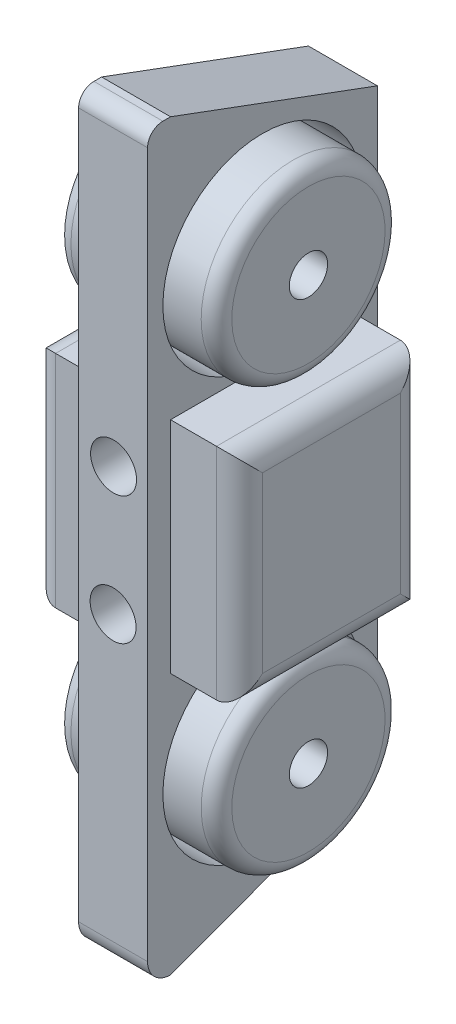
ISO-10303-21;
HEADER;
FILE_DESCRIPTION(('STEP AP214'),'2;1');
FILE_NAME('part.step','',(''),(''),'','','');
FILE_SCHEMA(('AUTOMOTIVE_DESIGN { 1 0 10303 214 1 1 1 1 }'));
ENDSEC;
DATA;
#1=APPLICATION_CONTEXT('core data for automotive mechanical design processes');
#2=APPLICATION_PROTOCOL_DEFINITION('international standard','automotive_design',2000,#1);
#3=PRODUCT_CONTEXT('',#1,'mechanical');
#4=PRODUCT('Part','Part','',(#3));
#5=PRODUCT_RELATED_PRODUCT_CATEGORY('part','',(#4));
#6=PRODUCT_DEFINITION_FORMATION('','',#4);
#7=PRODUCT_DEFINITION_CONTEXT('part definition',#1,'design');
#8=PRODUCT_DEFINITION('design','',#6,#7);
#9=PRODUCT_DEFINITION_SHAPE('','',#8);
#10=(LENGTH_UNIT() NAMED_UNIT(*) SI_UNIT(.MILLI.,.METRE.));
#11=(NAMED_UNIT(*) PLANE_ANGLE_UNIT() SI_UNIT($,.RADIAN.));
#12=(NAMED_UNIT(*) SI_UNIT($,.STERADIAN.) SOLID_ANGLE_UNIT());
#13=UNCERTAINTY_MEASURE_WITH_UNIT(LENGTH_MEASURE(1.E-05),#10,'distance_accuracy_value','');
#14=(GEOMETRIC_REPRESENTATION_CONTEXT(3) GLOBAL_UNCERTAINTY_ASSIGNED_CONTEXT((#13)) GLOBAL_UNIT_ASSIGNED_CONTEXT((#10,
#11,#12)) REPRESENTATION_CONTEXT('',''));
#15=CARTESIAN_POINT('',(0.,0.,0.));
#16=DIRECTION('',(0.,0.,1.));
#17=DIRECTION('',(1.,0.,0.));
#18=AXIS2_PLACEMENT_3D('',#15,#16,#17);
#19=CARTESIAN_POINT('',(15.,76.1111111111111,-12.));
#20=DIRECTION('',(-1.,0.,0.));
#21=DIRECTION('',(0.,-1.,0.));
#22=AXIS2_PLACEMENT_3D('',#19,#20,#21);
#23=CYLINDRICAL_SURFACE('',#22,12.);
#24=CARTESIAN_POINT('',(-4.,76.1111111111111,-12.));
#25=DIRECTION('',(-1.,0.,0.));
#26=DIRECTION('',(0.,0.,1.));
#27=AXIS2_PLACEMENT_3D('',#24,#25,#26);
#28=CIRCLE('',#27,12.);
#29=CARTESIAN_POINT('',(-4.,76.1111111111111,0.));
#30=VERTEX_POINT('',#29);
#31=EDGE_CURVE('E62',#30,#30,#28,.F.);
#32=ORIENTED_EDGE('',*,*,#31,.T.);
#33=EDGE_LOOP('',(#32));
#34=FACE_BOUND('',#33,.T.);
#35=CARTESIAN_POINT('',(13.,76.1111111111111,-12.));
#36=DIRECTION('',(1.,0.,0.));
#37=DIRECTION('',(0.,1.,0.));
#38=AXIS2_PLACEMENT_3D('',#35,#36,#37);
#39=CIRCLE('',#38,12.);
#40=CARTESIAN_POINT('',(13.,88.1111111111111,-12.));
#41=VERTEX_POINT('',#40);
#42=EDGE_CURVE('E66',#41,#41,#39,.F.);
#43=ORIENTED_EDGE('',*,*,#42,.T.);
#44=EDGE_LOOP('',(#43));
#45=FACE_BOUND('',#44,.T.);
#46=ADVANCED_FACE('F55',(#34,#45),#23,.T.);
#47=CARTESIAN_POINT('',(15.,0.,0.));
#48=DIRECTION('',(1.,0.,0.));
#49=DIRECTION('',(0.,1.,0.));
#50=AXIS2_PLACEMENT_3D('',#47,#48,#49);
#51=PLANE('',#50);
#52=CARTESIAN_POINT('',(15.,76.1111111111111,-12.));
#53=DIRECTION('',(1.,0.,0.));
#54=DIRECTION('',(0.,1.,0.));
#55=AXIS2_PLACEMENT_3D('',#52,#53,#54);
#56=CIRCLE('',#55,9.99999999999999);
#57=CARTESIAN_POINT('',(15.,86.1111111111111,-12.));
#58=VERTEX_POINT('',#57);
#59=EDGE_CURVE('E12',#58,#58,#56,.T.);
#60=ORIENTED_EDGE('',*,*,#59,.T.);
#61=EDGE_LOOP('',(#60));
#62=FACE_BOUND('',#61,.T.);
#63=CARTESIAN_POINT('',(15.,76.1111111111111,-12.));
#64=DIRECTION('',(1.,0.,0.));
#65=DIRECTION('',(0.,1.,0.));
#66=AXIS2_PLACEMENT_3D('',#63,#64,#65);
#67=CIRCLE('',#66,2.5);
#68=CARTESIAN_POINT('',(15.,78.6111111111111,-12.));
#69=VERTEX_POINT('',#68);
#70=EDGE_CURVE('E78',#69,#69,#67,.T.);
#71=ORIENTED_EDGE('',*,*,#70,.F.);
#72=EDGE_LOOP('',(#71));
#73=FACE_BOUND('',#72,.T.);
#74=ADVANCED_FACE('F85',(#62,#73),#51,.T.);
#75=CARTESIAN_POINT('',(-6.,0.,0.));
#76=DIRECTION('',(-1.,0.,0.));
#77=DIRECTION('',(0.,0.,1.));
#78=AXIS2_PLACEMENT_3D('',#75,#76,#77);
#79=PLANE('',#78);
#80=CARTESIAN_POINT('',(-6.,76.1111111111111,-12.));
#81=DIRECTION('',(-1.,0.,0.));
#82=DIRECTION('',(0.,0.,1.));
#83=AXIS2_PLACEMENT_3D('',#80,#81,#82);
#84=CIRCLE('',#83,9.99999999999999);
#85=CARTESIAN_POINT('',(-6.,76.1111111111111,-2.00000000000001));
#86=VERTEX_POINT('',#85);
#87=EDGE_CURVE('E70',#86,#86,#84,.T.);
#88=ORIENTED_EDGE('',*,*,#87,.T.);
#89=EDGE_LOOP('',(#88));
#90=FACE_BOUND('',#89,.T.);
#91=CARTESIAN_POINT('',(-6.,76.1111111111111,-12.));
#92=DIRECTION('',(-1.,0.,0.));
#93=DIRECTION('',(0.,0.,1.));
#94=AXIS2_PLACEMENT_3D('',#91,#92,#93);
#95=CIRCLE('',#94,2.5);
#96=CARTESIAN_POINT('',(-6.,76.1111111111111,-9.5));
#97=VERTEX_POINT('',#96);
#98=EDGE_CURVE('E75',#97,#97,#95,.T.);
#99=ORIENTED_EDGE('',*,*,#98,.F.);
#100=EDGE_LOOP('',(#99));
#101=FACE_BOUND('',#100,.T.);
#102=ADVANCED_FACE('F87',(#90,#101),#79,.T.);
#103=CARTESIAN_POINT('',(40.,76.1111111111111,-12.));
#104=DIRECTION('',(-1.,0.,0.));
#105=DIRECTION('',(0.,0.,1.));
#106=AXIS2_PLACEMENT_3D('',#103,#104,#105);
#107=CYLINDRICAL_SURFACE('',#106,2.5);
#108=ORIENTED_EDGE('',*,*,#70,.T.);
#109=EDGE_LOOP('',(#108));
#110=FACE_BOUND('',#109,.T.);
#111=ORIENTED_EDGE('',*,*,#98,.T.);
#112=EDGE_LOOP('',(#111));
#113=FACE_BOUND('',#112,.T.);
#114=ADVANCED_FACE('F82',(#110,#113),#107,.F.);
#115=CARTESIAN_POINT('',(-4.,76.1111111111111,-12.));
#116=DIRECTION('',(-1.,0.,0.));
#117=DIRECTION('',(0.,0.,1.));
#118=AXIS2_PLACEMENT_3D('',#115,#116,#117);
#119=TOROIDAL_SURFACE('',#118,9.99999999999999,2.);
#120=ORIENTED_EDGE('',*,*,#31,.F.);
#121=EDGE_LOOP('',(#120));
#122=FACE_BOUND('',#121,.T.);
#123=ORIENTED_EDGE('',*,*,#87,.F.);
#124=EDGE_LOOP('',(#123));
#125=FACE_BOUND('',#124,.T.);
#126=ADVANCED_FACE('F98',(#122,#125),#119,.T.);
#127=CARTESIAN_POINT('',(13.,76.1111111111111,-12.));
#128=DIRECTION('',(1.,0.,0.));
#129=DIRECTION('',(0.,1.,0.));
#130=AXIS2_PLACEMENT_3D('',#127,#128,#129);
#131=TOROIDAL_SURFACE('',#130,9.99999999999999,2.);
#132=ORIENTED_EDGE('',*,*,#42,.F.);
#133=EDGE_LOOP('',(#132));
#134=FACE_BOUND('',#133,.T.);
#135=ORIENTED_EDGE('',*,*,#59,.F.);
#136=EDGE_LOOP('',(#135));
#137=FACE_BOUND('',#136,.T.);
#138=ADVANCED_FACE('F57',(#134,#137),#131,.T.);
#139=CLOSED_SHELL('',(#46,#74,#102,#114,#126,#138));
#140=MANIFOLD_SOLID_BREP('B2',#139);
#141=CARTESIAN_POINT('',(-6.,0.,0.));
#142=DIRECTION('',(-1.,0.,0.));
#143=DIRECTION('',(0.,0.,1.));
#144=AXIS2_PLACEMENT_3D('',#141,#142,#143);
#145=PLANE('',#144);
#146=CARTESIAN_POINT('',(-6.,20.8888888888889,-12.));
#147=DIRECTION('',(-1.,0.,0.));
#148=DIRECTION('',(0.,0.,1.));
#149=AXIS2_PLACEMENT_3D('',#146,#147,#148);
#150=CIRCLE('',#149,10.);
#151=CARTESIAN_POINT('',(-6.,20.8888888888889,-1.99999999999999));
#152=VERTEX_POINT('',#151);
#153=EDGE_CURVE('E182',#152,#152,#150,.T.);
#154=ORIENTED_EDGE('',*,*,#153,.T.);
#155=EDGE_LOOP('',(#154));
#156=FACE_BOUND('',#155,.T.);
#157=CARTESIAN_POINT('',(-6.,20.8888888888889,-12.));
#158=DIRECTION('',(-1.,0.,0.));
#159=DIRECTION('',(0.,0.,1.));
#160=AXIS2_PLACEMENT_3D('',#157,#158,#159);
#161=CIRCLE('',#160,2.5);
#162=CARTESIAN_POINT('',(-6.,20.8888888888889,-9.49999999999999));
#163=VERTEX_POINT('',#162);
#164=EDGE_CURVE('E187',#163,#163,#161,.T.);
#165=ORIENTED_EDGE('',*,*,#164,.F.);
#166=EDGE_LOOP('',(#165));
#167=FACE_BOUND('',#166,.T.);
#168=ADVANCED_FACE('F167',(#156,#167),#145,.T.);
#169=CARTESIAN_POINT('',(-6.,20.8888888888889,-12.));
#170=DIRECTION('',(1.,0.,0.));
#171=DIRECTION('',(0.,0.,-1.));
#172=AXIS2_PLACEMENT_3D('',#169,#170,#171);
#173=CYLINDRICAL_SURFACE('',#172,12.);
#174=CARTESIAN_POINT('',(-4.,20.8888888888889,-12.));
#175=DIRECTION('',(-1.,0.,0.));
#176=DIRECTION('',(0.,0.,1.));
#177=AXIS2_PLACEMENT_3D('',#174,#175,#176);
#178=CIRCLE('',#177,12.);
#179=CARTESIAN_POINT('',(-4.,20.8888888888889,0.));
#180=VERTEX_POINT('',#179);
#181=EDGE_CURVE('E174',#180,#180,#178,.F.);
#182=ORIENTED_EDGE('',*,*,#181,.T.);
#183=EDGE_LOOP('',(#182));
#184=FACE_BOUND('',#183,.T.);
#185=CARTESIAN_POINT('',(13.,20.8888888888889,-12.));
#186=DIRECTION('',(1.,0.,0.));
#187=DIRECTION('',(0.,1.,0.));
#188=AXIS2_PLACEMENT_3D('',#185,#186,#187);
#189=CIRCLE('',#188,12.);
#190=CARTESIAN_POINT('',(13.,32.8888888888889,-12.));
#191=VERTEX_POINT('',#190);
#192=EDGE_CURVE('E178',#191,#191,#189,.F.);
#193=ORIENTED_EDGE('',*,*,#192,.T.);
#194=EDGE_LOOP('',(#193));
#195=FACE_BOUND('',#194,.T.);
#196=ADVANCED_FACE('F206',(#184,#195),#173,.T.);
#197=CARTESIAN_POINT('',(40.,20.8888888888889,-12.));
#198=DIRECTION('',(-1.,0.,0.));
#199=DIRECTION('',(0.,0.,1.));
#200=AXIS2_PLACEMENT_3D('',#197,#198,#199);
#201=CYLINDRICAL_SURFACE('',#200,2.5);
#202=CARTESIAN_POINT('',(15.,20.8888888888889,-12.));
#203=DIRECTION('',(1.,0.,0.));
#204=DIRECTION('',(0.,1.,0.));
#205=AXIS2_PLACEMENT_3D('',#202,#203,#204);
#206=CIRCLE('',#205,2.5);
#207=CARTESIAN_POINT('',(15.,23.3888888888889,-12.));
#208=VERTEX_POINT('',#207);
#209=EDGE_CURVE('E190',#208,#208,#206,.T.);
#210=ORIENTED_EDGE('',*,*,#209,.T.);
#211=EDGE_LOOP('',(#210));
#212=FACE_BOUND('',#211,.T.);
#213=ORIENTED_EDGE('',*,*,#164,.T.);
#214=EDGE_LOOP('',(#213));
#215=FACE_BOUND('',#214,.T.);
#216=ADVANCED_FACE('F194',(#212,#215),#201,.F.);
#217=CARTESIAN_POINT('',(15.,0.,0.));
#218=DIRECTION('',(1.,0.,0.));
#219=DIRECTION('',(0.,1.,0.));
#220=AXIS2_PLACEMENT_3D('',#217,#218,#219);
#221=PLANE('',#220);
#222=CARTESIAN_POINT('',(15.,20.8888888888889,-12.));
#223=DIRECTION('',(1.,0.,0.));
#224=DIRECTION('',(0.,1.,0.));
#225=AXIS2_PLACEMENT_3D('',#222,#223,#224);
#226=CIRCLE('',#225,10.);
#227=CARTESIAN_POINT('',(15.,30.8888888888889,-12.));
#228=VERTEX_POINT('',#227);
#229=EDGE_CURVE('E54',#228,#228,#226,.T.);
#230=ORIENTED_EDGE('',*,*,#229,.T.);
#231=EDGE_LOOP('',(#230));
#232=FACE_BOUND('',#231,.T.);
#233=ORIENTED_EDGE('',*,*,#209,.F.);
#234=EDGE_LOOP('',(#233));
#235=FACE_BOUND('',#234,.T.);
#236=ADVANCED_FACE('F197',(#232,#235),#221,.T.);
#237=CARTESIAN_POINT('',(-4.,20.8888888888889,-12.));
#238=DIRECTION('',(-1.,0.,0.));
#239=DIRECTION('',(0.,0.,1.));
#240=AXIS2_PLACEMENT_3D('',#237,#238,#239);
#241=TOROIDAL_SURFACE('',#240,10.,2.);
#242=ORIENTED_EDGE('',*,*,#181,.F.);
#243=EDGE_LOOP('',(#242));
#244=FACE_BOUND('',#243,.T.);
#245=ORIENTED_EDGE('',*,*,#153,.F.);
#246=EDGE_LOOP('',(#245));
#247=FACE_BOUND('',#246,.T.);
#248=ADVANCED_FACE('F199',(#244,#247),#241,.T.);
#249=CARTESIAN_POINT('',(13.,20.8888888888889,-12.));
#250=DIRECTION('',(1.,0.,0.));
#251=DIRECTION('',(0.,1.,0.));
#252=AXIS2_PLACEMENT_3D('',#249,#250,#251);
#253=TOROIDAL_SURFACE('',#252,10.,2.);
#254=ORIENTED_EDGE('',*,*,#192,.F.);
#255=EDGE_LOOP('',(#254));
#256=FACE_BOUND('',#255,.T.);
#257=ORIENTED_EDGE('',*,*,#229,.F.);
#258=EDGE_LOOP('',(#257));
#259=FACE_BOUND('',#258,.T.);
#260=ADVANCED_FACE('F169',(#256,#259),#253,.T.);
#261=CLOSED_SHELL('',(#168,#196,#216,#236,#248,#260));
#262=MANIFOLD_SOLID_BREP('B7',#261);
#263=CARTESIAN_POINT('',(0.,97.,-27.));
#264=DIRECTION('',(0.,0.,-1.));
#265=DIRECTION('',(0.,1.,0.));
#266=AXIS2_PLACEMENT_3D('',#263,#264,#265);
#267=PLANE('',#266);
#268=CARTESIAN_POINT('',(4.56013591850945,56.7522126867366,-27.));
#269=DIRECTION('',(0.,0.,-1.));
#270=DIRECTION('',(0.,1.,0.));
#271=AXIS2_PLACEMENT_3D('',#268,#269,#270);
#272=CIRCLE('',#271,3.);
#273=CARTESIAN_POINT('',(4.56013591850945,59.7522126867366,-27.));
#274=VERTEX_POINT('',#273);
#275=EDGE_CURVE('E968',#274,#274,#272,.T.);
#276=ORIENTED_EDGE('',*,*,#275,.F.);
#277=EDGE_LOOP('',(#276));
#278=FACE_BOUND('',#277,.T.);
#279=CARTESIAN_POINT('',(4.5,40.0222776188531,-27.));
#280=DIRECTION('',(0.,0.,-1.));
#281=DIRECTION('',(0.,1.,0.));
#282=AXIS2_PLACEMENT_3D('',#279,#280,#281);
#283=CIRCLE('',#282,3.);
#284=CARTESIAN_POINT('',(4.5,43.0222776188531,-27.));
#285=VERTEX_POINT('',#284);
#286=EDGE_CURVE('E973',#285,#285,#283,.T.);
#287=ORIENTED_EDGE('',*,*,#286,.F.);
#288=EDGE_LOOP('',(#287));
#289=FACE_BOUND('',#288,.T.);
#290=DIRECTION('',(0.,1.,0.));
#291=VECTOR('',#290,1.);
#292=CARTESIAN_POINT('',(0.,97.,-27.));
#293=LINE('',#292,#291);
#294=CARTESIAN_POINT('',(0.,10.,-27.));
#295=VERTEX_POINT('',#294);
#296=CARTESIAN_POINT('',(0.,87.,-27.));
#297=VERTEX_POINT('',#296);
#298=EDGE_CURVE('E461',#295,#297,#293,.T.);
#299=ORIENTED_EDGE('',*,*,#298,.T.);
#300=DIRECTION('',(1.,0.,0.));
#301=VECTOR('',#300,1.);
#302=CARTESIAN_POINT('',(0.,87.,-27.));
#303=LINE('',#302,#301);
#304=CARTESIAN_POINT('',(9.,87.,-27.));
#305=VERTEX_POINT('',#304);
#306=EDGE_CURVE('E445',#297,#305,#303,.T.);
#307=ORIENTED_EDGE('',*,*,#306,.T.);
#308=DIRECTION('',(0.,1.,0.));
#309=VECTOR('',#308,1.);
#310=CARTESIAN_POINT('',(9.,97.,-27.));
#311=LINE('',#310,#309);
#312=CARTESIAN_POINT('',(9.00000000000001,10.,-27.));
#313=VERTEX_POINT('',#312);
#314=EDGE_CURVE('E453',#313,#305,#311,.T.);
#315=ORIENTED_EDGE('',*,*,#314,.F.);
#316=DIRECTION('',(1.,0.,0.));
#317=VECTOR('',#316,1.);
#318=CARTESIAN_POINT('',(0.,10.,-27.));
#319=LINE('',#318,#317);
#320=EDGE_CURVE('E449',#295,#313,#319,.T.);
#321=ORIENTED_EDGE('',*,*,#320,.F.);
#322=EDGE_LOOP('',(#299,#307,#315,#321));
#323=FACE_BOUND('',#322,.T.);
#324=ADVANCED_FACE('F270',(#278,#289,#323),#267,.T.);
#325=CARTESIAN_POINT('',(15.,62.7522126867366,0.));
#326=DIRECTION('',(0.,-1.,0.));
#327=DIRECTION('',(1.,0.,0.));
#328=AXIS2_PLACEMENT_3D('',#325,#326,#327);
#329=PLANE('',#328);
#330=DIRECTION('',(1.,0.,0.));
#331=VECTOR('',#330,1.);
#332=CARTESIAN_POINT('',(9.,62.7522126867366,0.));
#333=LINE('',#332,#331);
#334=CARTESIAN_POINT('',(9.,62.7522126867366,0.));
#335=VERTEX_POINT('',#334);
#336=CARTESIAN_POINT('',(15.,62.7522126867366,0.));
#337=VERTEX_POINT('',#336);
#338=EDGE_CURVE('E951',#335,#337,#333,.T.);
#339=ORIENTED_EDGE('',*,*,#338,.T.);
#340=DIRECTION('',(0.,0.,1.));
#341=VECTOR('',#340,1.);
#342=CARTESIAN_POINT('',(15.,62.7522126867366,-24.));
#343=LINE('',#342,#341);
#344=CARTESIAN_POINT('',(15.,62.7522126867366,-24.));
#345=VERTEX_POINT('',#344);
#346=EDGE_CURVE('E508',#337,#345,#343,.F.);
#347=ORIENTED_EDGE('',*,*,#346,.T.);
#348=DIRECTION('',(1.,0.,0.));
#349=VECTOR('',#348,1.);
#350=CARTESIAN_POINT('',(9.,62.7522126867366,-24.));
#351=LINE('',#350,#349);
#352=CARTESIAN_POINT('',(9.,62.7522126867366,-24.));
#353=VERTEX_POINT('',#352);
#354=EDGE_CURVE('E938',#353,#345,#351,.T.);
#355=ORIENTED_EDGE('',*,*,#354,.F.);
#356=DIRECTION('',(0.,0.,1.));
#357=VECTOR('',#356,1.);
#358=CARTESIAN_POINT('',(9.,62.7522126867366,0.));
#359=LINE('',#358,#357);
#360=EDGE_CURVE('E431',#353,#335,#359,.T.);
#361=ORIENTED_EDGE('',*,*,#360,.T.);
#362=EDGE_LOOP('',(#339,#347,#355,#361));
#363=FACE_BOUND('',#362,.T.);
#364=ADVANCED_FACE('F580',(#363),#329,.F.);
#365=CARTESIAN_POINT('',(15.,34.0673795577351,0.));
#366=DIRECTION('',(0.,1.,0.));
#367=DIRECTION('',(-1.,0.,0.));
#368=AXIS2_PLACEMENT_3D('',#365,#366,#367);
#369=PLANE('',#368);
#370=DIRECTION('',(1.,0.,0.));
#371=VECTOR('',#370,1.);
#372=CARTESIAN_POINT('',(9.00000000000001,34.0673795577351,-24.));
#373=LINE('',#372,#371);
#374=CARTESIAN_POINT('',(9.00000000000001,34.0673795577351,-24.));
#375=VERTEX_POINT('',#374);
#376=CARTESIAN_POINT('',(15.,34.0673795577351,-24.));
#377=VERTEX_POINT('',#376);
#378=EDGE_CURVE('E932',#375,#377,#373,.T.);
#379=ORIENTED_EDGE('',*,*,#378,.T.);
#380=DIRECTION('',(0.,0.,-1.));
#381=VECTOR('',#380,1.);
#382=CARTESIAN_POINT('',(15.,34.0673795577351,0.));
#383=LINE('',#382,#381);
#384=CARTESIAN_POINT('',(15.,34.0673795577351,0.));
#385=VERTEX_POINT('',#384);
#386=EDGE_CURVE('E511',#377,#385,#383,.F.);
#387=ORIENTED_EDGE('',*,*,#386,.T.);
#388=DIRECTION('',(1.,0.,0.));
#389=VECTOR('',#388,1.);
#390=CARTESIAN_POINT('',(9.00000000000001,34.0673795577351,0.));
#391=LINE('',#390,#389);
#392=CARTESIAN_POINT('',(9.00000000000001,34.0673795577351,0.));
#393=VERTEX_POINT('',#392);
#394=EDGE_CURVE('E953',#393,#385,#391,.T.);
#395=ORIENTED_EDGE('',*,*,#394,.F.);
#396=DIRECTION('',(0.,0.,-1.));
#397=VECTOR('',#396,1.);
#398=CARTESIAN_POINT('',(9.00000000000001,34.0673795577351,0.));
#399=LINE('',#398,#397);
#400=EDGE_CURVE('E426',#393,#375,#399,.T.);
#401=ORIENTED_EDGE('',*,*,#400,.T.);
#402=EDGE_LOOP('',(#379,#387,#395,#401));
#403=FACE_BOUND('',#402,.T.);
#404=ADVANCED_FACE('F586',(#403),#369,.F.);
#405=CARTESIAN_POINT('',(9.00000000000001,0.,3.));
#406=DIRECTION('',(-1.,0.,0.));
#407=DIRECTION('',(0.,-1.,0.));
#408=AXIS2_PLACEMENT_3D('',#405,#406,#407);
#409=PLANE('',#408);
#410=DIRECTION('',(0.,-1.,0.));
#411=VECTOR('',#410,1.);
#412=CARTESIAN_POINT('',(9.,62.7522126867366,0.));
#413=LINE('',#412,#411);
#414=EDGE_CURVE('E960',#335,#393,#413,.T.);
#415=ORIENTED_EDGE('',*,*,#414,.F.);
#416=ORIENTED_EDGE('',*,*,#360,.F.);
#417=DIRECTION('',(0.,-1.,0.));
#418=VECTOR('',#417,1.);
#419=CARTESIAN_POINT('',(9.,62.7522126867366,-24.));
#420=LINE('',#419,#418);
#421=EDGE_CURVE('E966',#353,#375,#420,.T.);
#422=ORIENTED_EDGE('',*,*,#421,.T.);
#423=ORIENTED_EDGE('',*,*,#400,.F.);
#424=EDGE_LOOP('',(#415,#416,#422,#423));
#425=FACE_BOUND('',#424,.T.);
#426=CARTESIAN_POINT('',(9.,76.1111111111111,-12.));
#427=DIRECTION('',(-1.,0.,0.));
#428=DIRECTION('',(0.,-1.,0.));
#429=AXIS2_PLACEMENT_3D('',#426,#427,#428);
#430=CIRCLE('',#429,13.);
#431=CARTESIAN_POINT('',(9.,63.1111111111111,-12.));
#432=VERTEX_POINT('',#431);
#433=EDGE_CURVE('E438',#432,#432,#430,.T.);
#434=ORIENTED_EDGE('',*,*,#433,.T.);
#435=EDGE_LOOP('',(#434));
#436=FACE_BOUND('',#435,.T.);
#437=DIRECTION('',(0.,0.,-1.));
#438=VECTOR('',#437,1.);
#439=CARTESIAN_POINT('',(9.,97.,0.));
#440=LINE('',#439,#438);
#441=CARTESIAN_POINT('',(9.,97.,1.));
#442=VERTEX_POINT('',#441);
#443=CARTESIAN_POINT('',(9.,97.,0.));
#444=VERTEX_POINT('',#443);
#445=EDGE_CURVE('E463',#442,#444,#440,.T.);
#446=ORIENTED_EDGE('',*,*,#445,.F.);
#447=CARTESIAN_POINT('',(9.,95.,1.));
#448=DIRECTION('',(-1.,0.,0.));
#449=DIRECTION('',(0.,-1.,0.));
#450=AXIS2_PLACEMENT_3D('',#447,#448,#449);
#451=CIRCLE('',#450,2.);
#452=CARTESIAN_POINT('',(9.,95.,3.));
#453=VERTEX_POINT('',#452);
#454=EDGE_CURVE('E497',#442,#453,#451,.F.);
#455=ORIENTED_EDGE('',*,*,#454,.T.);
#456=DIRECTION('',(0.,1.,0.));
#457=VECTOR('',#456,1.);
#458=CARTESIAN_POINT('',(9.00000000000001,0.,3.));
#459=LINE('',#458,#457);
#460=CARTESIAN_POINT('',(9.00000000000001,3.,3.));
#461=VERTEX_POINT('',#460);
#462=EDGE_CURVE('E470',#461,#453,#459,.T.);
#463=ORIENTED_EDGE('',*,*,#462,.F.);
#464=CARTESIAN_POINT('',(9.00000000000001,3.,0.));
#465=DIRECTION('',(-1.,0.,0.));
#466=DIRECTION('',(0.,-1.,0.));
#467=AXIS2_PLACEMENT_3D('',#464,#465,#466);
#468=CIRCLE('',#467,3.);
#469=CARTESIAN_POINT('',(9.00000000000001,0.,0.));
#470=VERTEX_POINT('',#469);
#471=EDGE_CURVE('E481',#461,#470,#468,.F.);
#472=ORIENTED_EDGE('',*,*,#471,.T.);
#473=DIRECTION('',(0.,-0.347314355823594,0.937748760723704));
#474=VECTOR('',#473,1.);
#475=CARTESIAN_POINT('',(9.00000000000001,0.,0.));
#476=LINE('',#475,#474);
#477=EDGE_CURVE('E442',#313,#470,#476,.T.);
#478=ORIENTED_EDGE('',*,*,#477,.F.);
#479=ORIENTED_EDGE('',*,*,#314,.T.);
#480=DIRECTION('',(0.,0.347314355823594,0.937748760723704));
#481=VECTOR('',#480,1.);
#482=CARTESIAN_POINT('',(9.,85.2991556091677,-31.5922798552472));
#483=LINE('',#482,#481);
#484=EDGE_CURVE('E446',#305,#444,#483,.T.);
#485=ORIENTED_EDGE('',*,*,#484,.T.);
#486=EDGE_LOOP('',(#446,#455,#463,#472,#478,#479,#485));
#487=FACE_BOUND('',#486,.T.);
#488=CARTESIAN_POINT('',(9.00000000000001,20.8888888888889,-12.));
#489=DIRECTION('',(-1.,0.,0.));
#490=DIRECTION('',(0.,-1.,0.));
#491=AXIS2_PLACEMENT_3D('',#488,#489,#490);
#492=CIRCLE('',#491,13.);
#493=CARTESIAN_POINT('',(9.00000000000001,7.88888888888888,-12.));
#494=VERTEX_POINT('',#493);
#495=EDGE_CURVE('E428',#494,#494,#492,.T.);
#496=ORIENTED_EDGE('',*,*,#495,.T.);
#497=EDGE_LOOP('',(#496));
#498=FACE_BOUND('',#497,.T.);
#499=ADVANCED_FACE('F607',(#425,#436,#487,#498),#409,.F.);
#500=CARTESIAN_POINT('',(0.,0.,0.));
#501=DIRECTION('',(0.,0.937748760723704,0.347314355823594));
#502=DIRECTION('',(0.,-0.347314355823594,0.937748760723704));
#503=AXIS2_PLACEMENT_3D('',#500,#501,#502);
#504=PLANE('',#503);
#505=ORIENTED_EDGE('',*,*,#477,.T.);
#506=DIRECTION('',(1.,0.,0.));
#507=VECTOR('',#506,1.);
#508=CARTESIAN_POINT('',(0.,0.,0.));
#509=LINE('',#508,#507);
#510=CARTESIAN_POINT('',(0.,0.,0.));
#511=VERTEX_POINT('',#510);
#512=EDGE_CURVE('E469',#511,#470,#509,.T.);
#513=ORIENTED_EDGE('',*,*,#512,.F.);
#514=DIRECTION('',(0.,-0.347314355823594,0.937748760723704));
#515=VECTOR('',#514,1.);
#516=CARTESIAN_POINT('',(0.,0.,0.));
#517=LINE('',#516,#515);
#518=EDGE_CURVE('E456',#295,#511,#517,.T.);
#519=ORIENTED_EDGE('',*,*,#518,.F.);
#520=ORIENTED_EDGE('',*,*,#320,.T.);
#521=EDGE_LOOP('',(#505,#513,#519,#520));
#522=FACE_BOUND('',#521,.T.);
#523=ADVANCED_FACE('F593',(#522),#504,.F.);
#524=CARTESIAN_POINT('',(0.,3.,0.));
#525=DIRECTION('',(-1.,0.,0.));
#526=DIRECTION('',(0.,0.,1.));
#527=AXIS2_PLACEMENT_3D('',#524,#525,#526);
#528=CYLINDRICAL_SURFACE('',#527,3.);
#529=CARTESIAN_POINT('',(0.,3.,0.));
#530=DIRECTION('',(-1.,0.,0.));
#531=DIRECTION('',(0.,0.,1.));
#532=AXIS2_PLACEMENT_3D('',#529,#530,#531);
#533=CIRCLE('',#532,3.);
#534=CARTESIAN_POINT('',(0.,3.,3.));
#535=VERTEX_POINT('',#534);
#536=EDGE_CURVE('E484',#511,#535,#533,.T.);
#537=ORIENTED_EDGE('',*,*,#536,.F.);
#538=ORIENTED_EDGE('',*,*,#512,.T.);
#539=ORIENTED_EDGE('',*,*,#471,.F.);
#540=DIRECTION('',(1.,0.,0.));
#541=VECTOR('',#540,1.);
#542=CARTESIAN_POINT('',(9.00000000000001,3.,3.));
#543=LINE('',#542,#541);
#544=EDGE_CURVE('E476',#535,#461,#543,.T.);
#545=ORIENTED_EDGE('',*,*,#544,.F.);
#546=EDGE_LOOP('',(#537,#538,#539,#545));
#547=FACE_BOUND('',#546,.T.);
#548=ADVANCED_FACE('F602',(#547),#528,.T.);
#549=CARTESIAN_POINT('',(0.,0.,3.));
#550=DIRECTION('',(0.,0.,1.));
#551=DIRECTION('',(1.,0.,0.));
#552=AXIS2_PLACEMENT_3D('',#549,#550,#551);
#553=PLANE('',#552);
#554=CARTESIAN_POINT('',(4.56013591850945,56.7522126867366,3.));
#555=DIRECTION('',(0.,0.,1.));
#556=DIRECTION('',(1.,0.,0.));
#557=AXIS2_PLACEMENT_3D('',#554,#555,#556);
#558=CIRCLE('',#557,3.);
#559=CARTESIAN_POINT('',(7.56013591850945,56.7522126867366,3.));
#560=VERTEX_POINT('',#559);
#561=EDGE_CURVE('E976',#560,#560,#558,.T.);
#562=ORIENTED_EDGE('',*,*,#561,.F.);
#563=EDGE_LOOP('',(#562));
#564=FACE_BOUND('',#563,.T.);
#565=CARTESIAN_POINT('',(4.5,40.0222776188531,3.));
#566=DIRECTION('',(0.,0.,1.));
#567=DIRECTION('',(1.,0.,0.));
#568=AXIS2_PLACEMENT_3D('',#565,#566,#567);
#569=CIRCLE('',#568,3.);
#570=CARTESIAN_POINT('',(7.5,40.0222776188531,3.));
#571=VERTEX_POINT('',#570);
#572=EDGE_CURVE('E539',#571,#571,#569,.T.);
#573=ORIENTED_EDGE('',*,*,#572,.F.);
#574=EDGE_LOOP('',(#573));
#575=FACE_BOUND('',#574,.T.);
#576=ORIENTED_EDGE('',*,*,#462,.T.);
#577=DIRECTION('',(-1.,0.,0.));
#578=VECTOR('',#577,1.);
#579=CARTESIAN_POINT('',(0.,95.,3.));
#580=LINE('',#579,#578);
#581=CARTESIAN_POINT('',(0.,95.,3.));
#582=VERTEX_POINT('',#581);
#583=EDGE_CURVE('E486',#453,#582,#580,.T.);
#584=ORIENTED_EDGE('',*,*,#583,.T.);
#585=DIRECTION('',(0.,1.,0.));
#586=VECTOR('',#585,1.);
#587=CARTESIAN_POINT('',(0.,0.,3.));
#588=LINE('',#587,#586);
#589=EDGE_CURVE('E473',#535,#582,#588,.T.);
#590=ORIENTED_EDGE('',*,*,#589,.F.);
#591=ORIENTED_EDGE('',*,*,#544,.T.);
#592=EDGE_LOOP('',(#576,#584,#590,#591));
#593=FACE_BOUND('',#592,.T.);
#594=ADVANCED_FACE('F598',(#564,#575,#593),#553,.T.);
#595=CARTESIAN_POINT('',(-4.,97.,0.));
#596=DIRECTION('',(0.,-1.,0.));
#597=DIRECTION('',(1.,0.,0.));
#598=AXIS2_PLACEMENT_3D('',#595,#596,#597);
#599=PLANE('',#598);
#600=DIRECTION('',(0.,0.,1.));
#601=VECTOR('',#600,1.);
#602=CARTESIAN_POINT('',(0.,97.,3.));
#603=LINE('',#602,#601);
#604=CARTESIAN_POINT('',(0.,97.,0.));
#605=VERTEX_POINT('',#604);
#606=CARTESIAN_POINT('',(0.,97.,1.));
#607=VERTEX_POINT('',#606);
#608=EDGE_CURVE('E466',#605,#607,#603,.T.);
#609=ORIENTED_EDGE('',*,*,#608,.T.);
#610=DIRECTION('',(-1.,0.,0.));
#611=VECTOR('',#610,1.);
#612=CARTESIAN_POINT('',(9.,97.,1.));
#613=LINE('',#612,#611);
#614=EDGE_CURVE('E495',#607,#442,#613,.F.);
#615=ORIENTED_EDGE('',*,*,#614,.T.);
#616=ORIENTED_EDGE('',*,*,#445,.T.);
#617=DIRECTION('',(1.,0.,0.));
#618=VECTOR('',#617,1.);
#619=CARTESIAN_POINT('',(0.,97.,0.));
#620=LINE('',#619,#618);
#621=EDGE_CURVE('E450',#605,#444,#620,.T.);
#622=ORIENTED_EDGE('',*,*,#621,.F.);
#623=EDGE_LOOP('',(#609,#615,#616,#622));
#624=FACE_BOUND('',#623,.T.);
#625=ADVANCED_FACE('F595',(#624),#599,.F.);
#626=CARTESIAN_POINT('',(0.,0.,3.));
#627=DIRECTION('',(-1.,0.,0.));
#628=DIRECTION('',(0.,0.,1.));
#629=AXIS2_PLACEMENT_3D('',#626,#627,#628);
#630=PLANE('',#629);
#631=DIRECTION('',(0.,0.,1.));
#632=VECTOR('',#631,1.);
#633=CARTESIAN_POINT('',(0.,62.7522126867366,0.));
#634=LINE('',#633,#632);
#635=CARTESIAN_POINT('',(0.,62.7522126867366,-24.));
#636=VERTEX_POINT('',#635);
#637=CARTESIAN_POINT('',(0.,62.7522126867366,0.));
#638=VERTEX_POINT('',#637);
#639=EDGE_CURVE('E417',#636,#638,#634,.T.);
#640=ORIENTED_EDGE('',*,*,#639,.T.);
#641=DIRECTION('',(0.,-1.,0.));
#642=VECTOR('',#641,1.);
#643=CARTESIAN_POINT('',(0.,62.7522126867366,0.));
#644=LINE('',#643,#642);
#645=CARTESIAN_POINT('',(0.,33.977175679971,0.));
#646=VERTEX_POINT('',#645);
#647=EDGE_CURVE('E401',#638,#646,#644,.T.);
#648=ORIENTED_EDGE('',*,*,#647,.T.);
#649=DIRECTION('',(0.,0.,1.));
#650=VECTOR('',#649,1.);
#651=CARTESIAN_POINT('',(0.,33.977175679971,0.));
#652=LINE('',#651,#650);
#653=CARTESIAN_POINT('',(0.,33.977175679971,-24.));
#654=VERTEX_POINT('',#653);
#655=EDGE_CURVE('E425',#654,#646,#652,.T.);
#656=ORIENTED_EDGE('',*,*,#655,.F.);
#657=DIRECTION('',(0.,1.,0.));
#658=VECTOR('',#657,1.);
#659=CARTESIAN_POINT('',(0.,33.977175679971,-24.));
#660=LINE('',#659,#658);
#661=EDGE_CURVE('E424',#654,#636,#660,.T.);
#662=ORIENTED_EDGE('',*,*,#661,.T.);
#663=EDGE_LOOP('',(#640,#648,#656,#662));
#664=FACE_BOUND('',#663,.T.);
#665=ORIENTED_EDGE('',*,*,#589,.T.);
#666=CARTESIAN_POINT('',(0.,95.,1.));
#667=DIRECTION('',(-1.,0.,0.));
#668=DIRECTION('',(0.,0.,1.));
#669=AXIS2_PLACEMENT_3D('',#666,#667,#668);
#670=CIRCLE('',#669,2.);
#671=EDGE_CURVE('E493',#582,#607,#670,.T.);
#672=ORIENTED_EDGE('',*,*,#671,.T.);
#673=ORIENTED_EDGE('',*,*,#608,.F.);
#674=DIRECTION('',(0.,0.347314355823594,0.937748760723704));
#675=VECTOR('',#674,1.);
#676=CARTESIAN_POINT('',(0.,85.2991556091677,-31.5922798552472));
#677=LINE('',#676,#675);
#678=EDGE_CURVE('E443',#297,#605,#677,.T.);
#679=ORIENTED_EDGE('',*,*,#678,.F.);
#680=ORIENTED_EDGE('',*,*,#298,.F.);
#681=ORIENTED_EDGE('',*,*,#518,.T.);
#682=ORIENTED_EDGE('',*,*,#536,.T.);
#683=EDGE_LOOP('',(#665,#672,#673,#679,#680,#681,#682));
#684=FACE_BOUND('',#683,.T.);
#685=CARTESIAN_POINT('',(0.,20.8888888888889,-12.));
#686=DIRECTION('',(-1.,0.,0.));
#687=DIRECTION('',(0.,0.,1.));
#688=AXIS2_PLACEMENT_3D('',#685,#686,#687);
#689=CIRCLE('',#688,13.);
#690=CARTESIAN_POINT('',(0.,20.8888888888889,1.00000000000001));
#691=VERTEX_POINT('',#690);
#692=EDGE_CURVE('E435',#691,#691,#689,.T.);
#693=ORIENTED_EDGE('',*,*,#692,.F.);
#694=EDGE_LOOP('',(#693));
#695=FACE_BOUND('',#694,.T.);
#696=CARTESIAN_POINT('',(0.,76.1111111111111,-12.));
#697=DIRECTION('',(-1.,0.,0.));
#698=DIRECTION('',(0.,0.,1.));
#699=AXIS2_PLACEMENT_3D('',#696,#697,#698);
#700=CIRCLE('',#699,13.);
#701=CARTESIAN_POINT('',(0.,76.1111111111111,0.999999999999997));
#702=VERTEX_POINT('',#701);
#703=EDGE_CURVE('E439',#702,#702,#700,.T.);
#704=ORIENTED_EDGE('',*,*,#703,.F.);
#705=EDGE_LOOP('',(#704));
#706=FACE_BOUND('',#705,.T.);
#707=ADVANCED_FACE('F422',(#664,#684,#695,#706),#630,.T.);
#708=CARTESIAN_POINT('',(0.,85.2991556091677,-31.5922798552472));
#709=DIRECTION('',(0.,0.937748760723704,-0.347314355823594));
#710=DIRECTION('',(0.,0.347314355823594,0.937748760723704));
#711=AXIS2_PLACEMENT_3D('',#708,#709,#710);
#712=PLANE('',#711);
#713=ORIENTED_EDGE('',*,*,#484,.F.);
#714=ORIENTED_EDGE('',*,*,#306,.F.);
#715=ORIENTED_EDGE('',*,*,#678,.T.);
#716=ORIENTED_EDGE('',*,*,#621,.T.);
#717=EDGE_LOOP('',(#713,#714,#715,#716));
#718=FACE_BOUND('',#717,.T.);
#719=ADVANCED_FACE('F606',(#718),#712,.T.);
#720=CARTESIAN_POINT('',(-31.,20.8888888888889,-12.));
#721=DIRECTION('',(1.,0.,0.));
#722=DIRECTION('',(0.,1.,0.));
#723=AXIS2_PLACEMENT_3D('',#720,#721,#722);
#724=CYLINDRICAL_SURFACE('',#723,13.);
#725=ORIENTED_EDGE('',*,*,#692,.T.);
#726=EDGE_LOOP('',(#725));
#727=FACE_BOUND('',#726,.T.);
#728=ORIENTED_EDGE('',*,*,#495,.F.);
#729=EDGE_LOOP('',(#728));
#730=FACE_BOUND('',#729,.T.);
#731=ADVANCED_FACE('F850',(#727,#730),#724,.F.);
#732=CARTESIAN_POINT('',(-31.,76.1111111111111,-12.));
#733=DIRECTION('',(1.,0.,0.));
#734=DIRECTION('',(0.,1.,0.));
#735=AXIS2_PLACEMENT_3D('',#732,#733,#734);
#736=CYLINDRICAL_SURFACE('',#735,13.);
#737=ORIENTED_EDGE('',*,*,#703,.T.);
#738=EDGE_LOOP('',(#737));
#739=FACE_BOUND('',#738,.T.);
#740=ORIENTED_EDGE('',*,*,#433,.F.);
#741=EDGE_LOOP('',(#740));
#742=FACE_BOUND('',#741,.T.);
#743=ADVANCED_FACE('F748',(#739,#742),#736,.F.);
#744=CARTESIAN_POINT('',(-6.,62.7522126867366,0.));
#745=DIRECTION('',(0.,1.,0.));
#746=DIRECTION('',(0.,0.,1.));
#747=AXIS2_PLACEMENT_3D('',#744,#745,#746);
#748=PLANE('',#747);
#749=DIRECTION('',(-1.,0.,0.));
#750=VECTOR('',#749,1.);
#751=CARTESIAN_POINT('',(0.,62.7522126867366,-24.));
#752=LINE('',#751,#750);
#753=CARTESIAN_POINT('',(-6.,62.7522126867366,-24.));
#754=VERTEX_POINT('',#753);
#755=EDGE_CURVE('E410',#636,#754,#752,.T.);
#756=ORIENTED_EDGE('',*,*,#755,.T.);
#757=DIRECTION('',(0.,0.,-1.));
#758=VECTOR('',#757,1.);
#759=CARTESIAN_POINT('',(-6.,62.7522126867366,0.));
#760=LINE('',#759,#758);
#761=CARTESIAN_POINT('',(-6.,62.7522126867366,0.));
#762=VERTEX_POINT('',#761);
#763=EDGE_CURVE('E419',#754,#762,#760,.F.);
#764=ORIENTED_EDGE('',*,*,#763,.T.);
#765=DIRECTION('',(-1.,0.,0.));
#766=VECTOR('',#765,1.);
#767=CARTESIAN_POINT('',(0.,62.7522126867366,0.));
#768=LINE('',#767,#766);
#769=EDGE_CURVE('E404',#638,#762,#768,.T.);
#770=ORIENTED_EDGE('',*,*,#769,.F.);
#771=ORIENTED_EDGE('',*,*,#639,.F.);
#772=EDGE_LOOP('',(#756,#764,#770,#771));
#773=FACE_BOUND('',#772,.T.);
#774=ADVANCED_FACE('F416',(#773),#748,.T.);
#775=CARTESIAN_POINT('',(-6.,33.977175679971,0.));
#776=DIRECTION('',(0.,1.,0.));
#777=DIRECTION('',(0.,0.,1.));
#778=AXIS2_PLACEMENT_3D('',#775,#776,#777);
#779=PLANE('',#778);
#780=DIRECTION('',(-1.,0.,0.));
#781=VECTOR('',#780,1.);
#782=CARTESIAN_POINT('',(0.,33.977175679971,0.));
#783=LINE('',#782,#781);
#784=CARTESIAN_POINT('',(-6.,33.977175679971,0.));
#785=VERTEX_POINT('',#784);
#786=EDGE_CURVE('E405',#646,#785,#783,.T.);
#787=ORIENTED_EDGE('',*,*,#786,.T.);
#788=DIRECTION('',(0.,0.,1.));
#789=VECTOR('',#788,1.);
#790=CARTESIAN_POINT('',(-6.,33.977175679971,-24.));
#791=LINE('',#790,#789);
#792=CARTESIAN_POINT('',(-6.,33.977175679971,-24.));
#793=VERTEX_POINT('',#792);
#794=EDGE_CURVE('E292',#785,#793,#791,.F.);
#795=ORIENTED_EDGE('',*,*,#794,.T.);
#796=DIRECTION('',(-1.,0.,0.));
#797=VECTOR('',#796,1.);
#798=CARTESIAN_POINT('',(0.,33.977175679971,-24.));
#799=LINE('',#798,#797);
#800=EDGE_CURVE('E561',#654,#793,#799,.T.);
#801=ORIENTED_EDGE('',*,*,#800,.F.);
#802=ORIENTED_EDGE('',*,*,#655,.T.);
#803=EDGE_LOOP('',(#787,#795,#801,#802));
#804=FACE_BOUND('',#803,.T.);
#805=ADVANCED_FACE('F728',(#804),#779,.F.);
#806=CARTESIAN_POINT('',(9.,62.7522126867366,-24.));
#807=DIRECTION('',(0.,0.,1.));
#808=DIRECTION('',(0.,-1.,0.));
#809=AXIS2_PLACEMENT_3D('',#806,#807,#808);
#810=PLANE('',#809);
#811=ORIENTED_EDGE('',*,*,#354,.T.);
#812=DIRECTION('',(0.,1.,0.));
#813=VECTOR('',#812,1.);
#814=CARTESIAN_POINT('',(15.,34.0673795577351,-24.));
#815=LINE('',#814,#813);
#816=EDGE_CURVE('E515',#345,#377,#815,.F.);
#817=ORIENTED_EDGE('',*,*,#816,.T.);
#818=ORIENTED_EDGE('',*,*,#378,.F.);
#819=ORIENTED_EDGE('',*,*,#421,.F.);
#820=EDGE_LOOP('',(#811,#817,#818,#819));
#821=FACE_BOUND('',#820,.T.);
#822=ADVANCED_FACE('F717',(#821),#810,.F.);
#823=CARTESIAN_POINT('',(9.,62.7522126867366,0.));
#824=DIRECTION('',(0.,0.,1.));
#825=DIRECTION('',(0.,-1.,0.));
#826=AXIS2_PLACEMENT_3D('',#823,#824,#825);
#827=PLANE('',#826);
#828=ORIENTED_EDGE('',*,*,#394,.T.);
#829=DIRECTION('',(0.,-1.,0.));
#830=VECTOR('',#829,1.);
#831=CARTESIAN_POINT('',(15.,62.7522126867366,0.));
#832=LINE('',#831,#830);
#833=EDGE_CURVE('E513',#385,#337,#832,.F.);
#834=ORIENTED_EDGE('',*,*,#833,.T.);
#835=ORIENTED_EDGE('',*,*,#338,.F.);
#836=ORIENTED_EDGE('',*,*,#414,.T.);
#837=EDGE_LOOP('',(#828,#834,#835,#836));
#838=FACE_BOUND('',#837,.T.);
#839=ADVANCED_FACE('F707',(#838),#827,.T.);
#840=CARTESIAN_POINT('',(0.,33.977175679971,-24.));
#841=DIRECTION('',(0.,0.,1.));
#842=DIRECTION('',(1.,0.,0.));
#843=AXIS2_PLACEMENT_3D('',#840,#841,#842);
#844=PLANE('',#843);
#845=ORIENTED_EDGE('',*,*,#800,.T.);
#846=DIRECTION('',(0.,-1.,0.));
#847=VECTOR('',#846,1.);
#848=CARTESIAN_POINT('',(-6.,62.7522126867366,-24.));
#849=LINE('',#848,#847);
#850=EDGE_CURVE('E279',#793,#754,#849,.F.);
#851=ORIENTED_EDGE('',*,*,#850,.T.);
#852=ORIENTED_EDGE('',*,*,#755,.F.);
#853=ORIENTED_EDGE('',*,*,#661,.F.);
#854=EDGE_LOOP('',(#845,#851,#852,#853));
#855=FACE_BOUND('',#854,.T.);
#856=ADVANCED_FACE('F560',(#855),#844,.F.);
#857=CARTESIAN_POINT('',(0.,62.7522126867366,0.));
#858=DIRECTION('',(0.,0.,-1.));
#859=DIRECTION('',(0.,1.,0.));
#860=AXIS2_PLACEMENT_3D('',#857,#858,#859);
#861=PLANE('',#860);
#862=ORIENTED_EDGE('',*,*,#769,.T.);
#863=DIRECTION('',(0.,1.,0.));
#864=VECTOR('',#863,1.);
#865=CARTESIAN_POINT('',(-6.,33.977175679971,0.));
#866=LINE('',#865,#864);
#867=EDGE_CURVE('E165',#762,#785,#866,.F.);
#868=ORIENTED_EDGE('',*,*,#867,.T.);
#869=ORIENTED_EDGE('',*,*,#786,.F.);
#870=ORIENTED_EDGE('',*,*,#647,.F.);
#871=EDGE_LOOP('',(#862,#868,#869,#870));
#872=FACE_BOUND('',#871,.T.);
#873=ADVANCED_FACE('F403',(#872),#861,.F.);
#874=CARTESIAN_POINT('',(-9.,0.,0.));
#875=DIRECTION('',(-1.,0.,0.));
#876=DIRECTION('',(0.,0.,1.));
#877=AXIS2_PLACEMENT_3D('',#874,#875,#876);
#878=PLANE('',#877);
#879=DIRECTION('',(0.,0.,-1.));
#880=VECTOR('',#879,1.);
#881=CARTESIAN_POINT('',(-9.,59.7522126867366,0.));
#882=LINE('',#881,#880);
#883=CARTESIAN_POINT('',(-9.,59.7522126867366,-3.));
#884=VERTEX_POINT('',#883);
#885=CARTESIAN_POINT('',(-9.,59.7522126867366,-21.));
#886=VERTEX_POINT('',#885);
#887=EDGE_CURVE('E521',#884,#886,#882,.T.);
#888=ORIENTED_EDGE('',*,*,#887,.T.);
#889=DIRECTION('',(0.,-1.,0.));
#890=VECTOR('',#889,1.);
#891=CARTESIAN_POINT('',(-9.,33.977175679971,-21.));
#892=LINE('',#891,#890);
#893=CARTESIAN_POINT('',(-9.,36.977175679971,-21.));
#894=VERTEX_POINT('',#893);
#895=EDGE_CURVE('E524',#886,#894,#892,.T.);
#896=ORIENTED_EDGE('',*,*,#895,.T.);
#897=DIRECTION('',(0.,0.,1.));
#898=VECTOR('',#897,1.);
#899=CARTESIAN_POINT('',(-9.,36.977175679971,0.));
#900=LINE('',#899,#898);
#901=CARTESIAN_POINT('',(-9.,36.977175679971,-3.));
#902=VERTEX_POINT('',#901);
#903=EDGE_CURVE('E519',#894,#902,#900,.T.);
#904=ORIENTED_EDGE('',*,*,#903,.T.);
#905=DIRECTION('',(0.,1.,0.));
#906=VECTOR('',#905,1.);
#907=CARTESIAN_POINT('',(-9.,62.7522126867366,-3.));
#908=LINE('',#907,#906);
#909=EDGE_CURVE('E517',#902,#884,#908,.T.);
#910=ORIENTED_EDGE('',*,*,#909,.T.);
#911=EDGE_LOOP('',(#888,#896,#904,#910));
#912=FACE_BOUND('',#911,.T.);
#913=ADVANCED_FACE('F567',(#912),#878,.T.);
#914=CARTESIAN_POINT('',(18.,0.,0.));
#915=DIRECTION('',(1.,0.,0.));
#916=DIRECTION('',(0.,1.,0.));
#917=AXIS2_PLACEMENT_3D('',#914,#915,#916);
#918=PLANE('',#917);
#919=DIRECTION('',(0.,0.,1.));
#920=VECTOR('',#919,1.);
#921=CARTESIAN_POINT('',(18.,59.7522126867366,0.));
#922=LINE('',#921,#920);
#923=CARTESIAN_POINT('',(18.,59.7522126867366,-21.));
#924=VERTEX_POINT('',#923);
#925=CARTESIAN_POINT('',(18.,59.7522126867366,-3.));
#926=VERTEX_POINT('',#925);
#927=EDGE_CURVE('E503',#924,#926,#922,.T.);
#928=ORIENTED_EDGE('',*,*,#927,.T.);
#929=DIRECTION('',(0.,-1.,0.));
#930=VECTOR('',#929,1.);
#931=CARTESIAN_POINT('',(18.,0.,-3.00000000000001));
#932=LINE('',#931,#930);
#933=CARTESIAN_POINT('',(18.,37.0673795577351,-3.));
#934=VERTEX_POINT('',#933);
#935=EDGE_CURVE('E506',#926,#934,#932,.T.);
#936=ORIENTED_EDGE('',*,*,#935,.T.);
#937=DIRECTION('',(0.,0.,-1.));
#938=VECTOR('',#937,1.);
#939=CARTESIAN_POINT('',(18.,37.0673795577351,-24.));
#940=LINE('',#939,#938);
#941=CARTESIAN_POINT('',(18.,37.0673795577351,-21.));
#942=VERTEX_POINT('',#941);
#943=EDGE_CURVE('E501',#934,#942,#940,.T.);
#944=ORIENTED_EDGE('',*,*,#943,.T.);
#945=DIRECTION('',(0.,1.,0.));
#946=VECTOR('',#945,1.);
#947=CARTESIAN_POINT('',(18.,62.7522126867366,-21.));
#948=LINE('',#947,#946);
#949=EDGE_CURVE('E499',#942,#924,#948,.T.);
#950=ORIENTED_EDGE('',*,*,#949,.T.);
#951=EDGE_LOOP('',(#928,#936,#944,#950));
#952=FACE_BOUND('',#951,.T.);
#953=ADVANCED_FACE('F569',(#952),#918,.T.);
#954=CARTESIAN_POINT('',(0.,95.,1.));
#955=DIRECTION('',(1.,0.,0.));
#956=DIRECTION('',(0.,1.,0.));
#957=AXIS2_PLACEMENT_3D('',#954,#955,#956);
#958=CYLINDRICAL_SURFACE('',#957,2.);
#959=ORIENTED_EDGE('',*,*,#454,.F.);
#960=ORIENTED_EDGE('',*,*,#614,.F.);
#961=ORIENTED_EDGE('',*,*,#671,.F.);
#962=ORIENTED_EDGE('',*,*,#583,.F.);
#963=EDGE_LOOP('',(#959,#960,#961,#962));
#964=FACE_BOUND('',#963,.T.);
#965=ADVANCED_FACE('F575',(#964),#958,.T.);
#966=CARTESIAN_POINT('',(4.5,40.0222776188531,-37.));
#967=DIRECTION('',(0.,0.,1.));
#968=DIRECTION('',(1.,0.,0.));
#969=AXIS2_PLACEMENT_3D('',#966,#967,#968);
#970=CYLINDRICAL_SURFACE('',#969,3.);
#971=ORIENTED_EDGE('',*,*,#286,.T.);
#972=EDGE_LOOP('',(#971));
#973=FACE_BOUND('',#972,.T.);
#974=ORIENTED_EDGE('',*,*,#572,.T.);
#975=EDGE_LOOP('',(#974));
#976=FACE_BOUND('',#975,.T.);
#977=ADVANCED_FACE('F616',(#973,#976),#970,.F.);
#978=CARTESIAN_POINT('',(4.56013591850945,56.7522126867366,-37.));
#979=DIRECTION('',(0.,0.,1.));
#980=DIRECTION('',(1.,0.,0.));
#981=AXIS2_PLACEMENT_3D('',#978,#979,#980);
#982=CYLINDRICAL_SURFACE('',#981,3.);
#983=ORIENTED_EDGE('',*,*,#275,.T.);
#984=EDGE_LOOP('',(#983));
#985=FACE_BOUND('',#984,.T.);
#986=ORIENTED_EDGE('',*,*,#561,.T.);
#987=EDGE_LOOP('',(#986));
#988=FACE_BOUND('',#987,.T.);
#989=ADVANCED_FACE('F633',(#985,#988),#982,.F.);
#990=CARTESIAN_POINT('',(15.,37.0673795577351,0.));
#991=DIRECTION('',(0.,0.,1.));
#992=DIRECTION('',(1.,0.,0.));
#993=AXIS2_PLACEMENT_3D('',#990,#991,#992);
#994=CYLINDRICAL_SURFACE('',#993,3.);
#995=CARTESIAN_POINT('',(15.,37.0673795577351,-3.));
#996=DIRECTION('',(0.,-0.707106781186547,-0.707106781186548));
#997=DIRECTION('',(0.,-0.707106781186548,0.707106781186547));
#998=AXIS2_PLACEMENT_3D('',#995,#996,#997);
#999=ELLIPSE('',#998,4.24264068711928,3.);
#1000=EDGE_CURVE('E533',#385,#934,#999,.F.);
#1001=ORIENTED_EDGE('',*,*,#1000,.F.);
#1002=ORIENTED_EDGE('',*,*,#386,.F.);
#1003=CARTESIAN_POINT('',(15.,37.0673795577351,-21.));
#1004=DIRECTION('',(0.,-0.707106781186548,0.707106781186547));
#1005=DIRECTION('',(0.,-0.707106781186547,-0.707106781186548));
#1006=AXIS2_PLACEMENT_3D('',#1003,#1004,#1005);
#1007=ELLIPSE('',#1006,4.24264068711929,3.);
#1008=EDGE_CURVE('E536',#942,#377,#1007,.F.);
#1009=ORIENTED_EDGE('',*,*,#1008,.F.);
#1010=ORIENTED_EDGE('',*,*,#943,.F.);
#1011=EDGE_LOOP('',(#1001,#1002,#1009,#1010));
#1012=FACE_BOUND('',#1011,.T.);
#1013=ADVANCED_FACE('F629',(#1012),#994,.T.);
#1014=CARTESIAN_POINT('',(15.,0.,-21.));
#1015=DIRECTION('',(0.,-1.,0.));
#1016=DIRECTION('',(0.,0.,-1.));
#1017=AXIS2_PLACEMENT_3D('',#1014,#1015,#1016);
#1018=CYLINDRICAL_SURFACE('',#1017,3.);
#1019=ORIENTED_EDGE('',*,*,#1008,.T.);
#1020=ORIENTED_EDGE('',*,*,#816,.F.);
#1021=CARTESIAN_POINT('',(15.,59.7522126867366,-21.));
#1022=DIRECTION('',(0.,-0.707106781186547,-0.707106781186548));
#1023=DIRECTION('',(0.,-0.707106781186548,0.707106781186547));
#1024=AXIS2_PLACEMENT_3D('',#1021,#1022,#1023);
#1025=ELLIPSE('',#1024,4.24264068711928,3.);
#1026=EDGE_CURVE('E531',#924,#345,#1025,.F.);
#1027=ORIENTED_EDGE('',*,*,#1026,.F.);
#1028=ORIENTED_EDGE('',*,*,#949,.F.);
#1029=EDGE_LOOP('',(#1019,#1020,#1027,#1028));
#1030=FACE_BOUND('',#1029,.T.);
#1031=ADVANCED_FACE('F625',(#1030),#1018,.T.);
#1032=CARTESIAN_POINT('',(15.,0.,-3.00000000000001));
#1033=DIRECTION('',(0.,-1.,0.));
#1034=DIRECTION('',(0.,0.,-1.));
#1035=AXIS2_PLACEMENT_3D('',#1032,#1033,#1034);
#1036=CYLINDRICAL_SURFACE('',#1035,3.);
#1037=ORIENTED_EDGE('',*,*,#1000,.T.);
#1038=ORIENTED_EDGE('',*,*,#935,.F.);
#1039=CARTESIAN_POINT('',(15.,59.7522126867366,-3.));
#1040=DIRECTION('',(0.,-0.707106781186548,0.707106781186547));
#1041=DIRECTION('',(0.,-0.707106781186547,-0.707106781186548));
#1042=AXIS2_PLACEMENT_3D('',#1039,#1040,#1041);
#1043=ELLIPSE('',#1042,4.24264068711929,3.);
#1044=EDGE_CURVE('E529',#337,#926,#1043,.F.);
#1045=ORIENTED_EDGE('',*,*,#1044,.F.);
#1046=ORIENTED_EDGE('',*,*,#833,.F.);
#1047=EDGE_LOOP('',(#1037,#1038,#1045,#1046));
#1048=FACE_BOUND('',#1047,.T.);
#1049=ADVANCED_FACE('F621',(#1048),#1036,.T.);
#1050=CARTESIAN_POINT('',(15.,59.7522126867366,0.));
#1051=DIRECTION('',(0.,0.,-1.));
#1052=DIRECTION('',(-1.,0.,0.));
#1053=AXIS2_PLACEMENT_3D('',#1050,#1051,#1052);
#1054=CYLINDRICAL_SURFACE('',#1053,3.);
#1055=ORIENTED_EDGE('',*,*,#1026,.T.);
#1056=ORIENTED_EDGE('',*,*,#346,.F.);
#1057=ORIENTED_EDGE('',*,*,#1044,.T.);
#1058=ORIENTED_EDGE('',*,*,#927,.F.);
#1059=EDGE_LOOP('',(#1055,#1056,#1057,#1058));
#1060=FACE_BOUND('',#1059,.T.);
#1061=ADVANCED_FACE('F618',(#1060),#1054,.T.);
#1062=CARTESIAN_POINT('',(-6.,36.977175679971,0.));
#1063=DIRECTION('',(0.,0.,-1.));
#1064=DIRECTION('',(-1.,0.,0.));
#1065=AXIS2_PLACEMENT_3D('',#1062,#1063,#1064);
#1066=CYLINDRICAL_SURFACE('',#1065,3.);
#1067=CARTESIAN_POINT('',(-6.,36.977175679971,-21.));
#1068=DIRECTION('',(0.,0.707106781186547,-0.707106781186547));
#1069=DIRECTION('',(0.,0.707106781186547,0.707106781186547));
#1070=AXIS2_PLACEMENT_3D('',#1067,#1068,#1069);
#1071=ELLIPSE('',#1070,4.24264068711928,3.);
#1072=EDGE_CURVE('E543',#793,#894,#1071,.T.);
#1073=ORIENTED_EDGE('',*,*,#1072,.F.);
#1074=ORIENTED_EDGE('',*,*,#794,.F.);
#1075=CARTESIAN_POINT('',(-6.,36.977175679971,-3.));
#1076=DIRECTION('',(0.,-0.707106781186548,-0.707106781186547));
#1077=DIRECTION('',(0.,-0.707106781186547,0.707106781186548));
#1078=AXIS2_PLACEMENT_3D('',#1075,#1076,#1077);
#1079=ELLIPSE('',#1078,4.24264068711929,3.);
#1080=EDGE_CURVE('E274',#902,#785,#1079,.F.);
#1081=ORIENTED_EDGE('',*,*,#1080,.F.);
#1082=ORIENTED_EDGE('',*,*,#903,.F.);
#1083=EDGE_LOOP('',(#1073,#1074,#1081,#1082));
#1084=FACE_BOUND('',#1083,.T.);
#1085=ADVANCED_FACE('F272',(#1084),#1066,.T.);
#1086=CARTESIAN_POINT('',(-6.,0.,-2.99999999999999));
#1087=DIRECTION('',(0.,-1.,0.));
#1088=DIRECTION('',(0.,0.,-1.));
#1089=AXIS2_PLACEMENT_3D('',#1086,#1087,#1088);
#1090=CYLINDRICAL_SURFACE('',#1089,3.);
#1091=ORIENTED_EDGE('',*,*,#1080,.T.);
#1092=ORIENTED_EDGE('',*,*,#867,.F.);
#1093=CARTESIAN_POINT('',(-6.,59.7522126867366,-3.));
#1094=DIRECTION('',(0.,-0.707106781186547,0.707106781186548));
#1095=DIRECTION('',(0.,-0.707106781186548,-0.707106781186547));
#1096=AXIS2_PLACEMENT_3D('',#1093,#1094,#1095);
#1097=ELLIPSE('',#1096,4.24264068711928,3.);
#1098=EDGE_CURVE('E542',#884,#762,#1097,.F.);
#1099=ORIENTED_EDGE('',*,*,#1098,.F.);
#1100=ORIENTED_EDGE('',*,*,#909,.F.);
#1101=EDGE_LOOP('',(#1091,#1092,#1099,#1100));
#1102=FACE_BOUND('',#1101,.T.);
#1103=ADVANCED_FACE('F553',(#1102),#1090,.T.);
#1104=CARTESIAN_POINT('',(-6.,0.,-21.));
#1105=DIRECTION('',(0.,1.,0.));
#1106=DIRECTION('',(0.,0.,1.));
#1107=AXIS2_PLACEMENT_3D('',#1104,#1105,#1106);
#1108=CYLINDRICAL_SURFACE('',#1107,3.);
#1109=ORIENTED_EDGE('',*,*,#1072,.T.);
#1110=ORIENTED_EDGE('',*,*,#895,.F.);
#1111=CARTESIAN_POINT('',(-6.,59.7522126867366,-21.));
#1112=DIRECTION('',(0.,0.707106781186547,0.707106781186547));
#1113=DIRECTION('',(0.,0.707106781186547,-0.707106781186547));
#1114=AXIS2_PLACEMENT_3D('',#1111,#1112,#1113);
#1115=ELLIPSE('',#1114,4.24264068711928,3.);
#1116=EDGE_CURVE('E540',#754,#886,#1115,.T.);
#1117=ORIENTED_EDGE('',*,*,#1116,.F.);
#1118=ORIENTED_EDGE('',*,*,#850,.F.);
#1119=EDGE_LOOP('',(#1109,#1110,#1117,#1118));
#1120=FACE_BOUND('',#1119,.T.);
#1121=ADVANCED_FACE('F558',(#1120),#1108,.T.);
#1122=CARTESIAN_POINT('',(-6.,59.7522126867366,0.));
#1123=DIRECTION('',(0.,0.,-1.));
#1124=DIRECTION('',(-1.,0.,0.));
#1125=AXIS2_PLACEMENT_3D('',#1122,#1123,#1124);
#1126=CYLINDRICAL_SURFACE('',#1125,3.);
#1127=ORIENTED_EDGE('',*,*,#1098,.T.);
#1128=ORIENTED_EDGE('',*,*,#763,.F.);
#1129=ORIENTED_EDGE('',*,*,#1116,.T.);
#1130=ORIENTED_EDGE('',*,*,#887,.F.);
#1131=EDGE_LOOP('',(#1127,#1128,#1129,#1130));
#1132=FACE_BOUND('',#1131,.T.);
#1133=ADVANCED_FACE('F564',(#1132),#1126,.T.);
#1134=CLOSED_SHELL('',(#324,#364,#404,#499,#523,#548,#594,#625,#707,#719,#731,#743,#774,#805,
#822,#839,#856,#873,#913,#953,#965,#977,#989,#1013,#1031,#1049,#1061,#1085,#1103,#1121,#1133));
#1135=MANIFOLD_SOLID_BREP('B49',#1134);
#1136=ADVANCED_BREP_SHAPE_REPRESENTATION('',(#18,#140,#262,#1135),#14);
#1137=SHAPE_DEFINITION_REPRESENTATION(#9,#1136);
ENDSEC;
END-ISO-10303-21;
